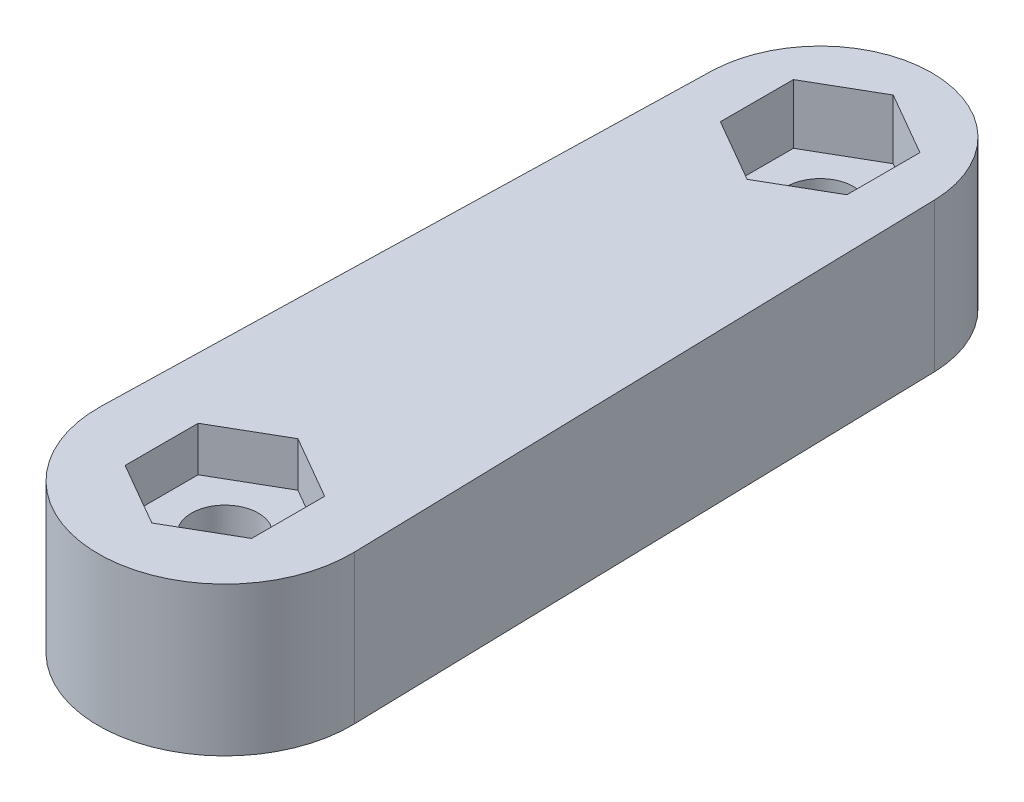
ISO-10303-21;
HEADER;
FILE_DESCRIPTION(('STEP AP214'),'2;1');
FILE_NAME('part.step','',(''),(''),'','','');
FILE_SCHEMA(('AUTOMOTIVE_DESIGN { 1 0 10303 214 1 1 1 1 }'));
ENDSEC;
DATA;
#1=APPLICATION_CONTEXT('core data for automotive mechanical design processes');
#2=APPLICATION_PROTOCOL_DEFINITION('international standard','automotive_design',2000,#1);
#3=PRODUCT_CONTEXT('',#1,'mechanical');
#4=PRODUCT('Part','Part','',(#3));
#5=PRODUCT_RELATED_PRODUCT_CATEGORY('part','',(#4));
#6=PRODUCT_DEFINITION_FORMATION('','',#4);
#7=PRODUCT_DEFINITION_CONTEXT('part definition',#1,'design');
#8=PRODUCT_DEFINITION('design','',#6,#7);
#9=PRODUCT_DEFINITION_SHAPE('','',#8);
#10=(LENGTH_UNIT() NAMED_UNIT(*) SI_UNIT(.MILLI.,.METRE.));
#11=(NAMED_UNIT(*) PLANE_ANGLE_UNIT() SI_UNIT($,.RADIAN.));
#12=(NAMED_UNIT(*) SI_UNIT($,.STERADIAN.) SOLID_ANGLE_UNIT());
#13=UNCERTAINTY_MEASURE_WITH_UNIT(LENGTH_MEASURE(1.E-05),#10,'distance_accuracy_value','');
#14=(GEOMETRIC_REPRESENTATION_CONTEXT(3) GLOBAL_UNCERTAINTY_ASSIGNED_CONTEXT((#13)) GLOBAL_UNIT_ASSIGNED_CONTEXT((#10,
#11,#12)) REPRESENTATION_CONTEXT('',''));
#15=CARTESIAN_POINT('',(0.,0.,0.));
#16=DIRECTION('',(0.,0.,1.));
#17=DIRECTION('',(1.,0.,0.));
#18=AXIS2_PLACEMENT_3D('',#15,#16,#17);
#19=CARTESIAN_POINT('',(0.,5.,0.));
#20=DIRECTION('',(0.,1.,0.));
#21=DIRECTION('',(0.,0.,1.));
#22=AXIS2_PLACEMENT_3D('',#19,#20,#21);
#23=PLANE('',#22);
#24=DIRECTION('',(0.025,0.,-0.99968745115661));
#25=VECTOR('',#24,1.);
#26=CARTESIAN_POINT('',(-4.24867166741559,5.,-0.10625));
#27=LINE('',#26,#25);
#28=CARTESIAN_POINT('',(-4.24867166741559,5.,-0.10625));
#29=VERTEX_POINT('',#28);
#30=CARTESIAN_POINT('',(-3.74882794183729,5.,-20.09375));
#31=VERTEX_POINT('',#30);
#32=EDGE_CURVE('E289',#29,#31,#27,.T.);
#33=ORIENTED_EDGE('',*,*,#32,.F.);
#34=CARTESIAN_POINT('',(0.,5.,0.));
#35=DIRECTION('',(0.,1.,0.));
#36=DIRECTION('',(0.,0.,1.));
#37=AXIS2_PLACEMENT_3D('',#34,#35,#36);
#38=CIRCLE('',#37,4.25);
#39=CARTESIAN_POINT('',(4.24867166741559,5.,-0.10625));
#40=VERTEX_POINT('',#39);
#41=EDGE_CURVE('E292',#29,#40,#38,.T.);
#42=ORIENTED_EDGE('',*,*,#41,.T.);
#43=DIRECTION('',(-0.025,0.,-0.99968745115661));
#44=VECTOR('',#43,1.);
#45=CARTESIAN_POINT('',(4.24867166741559,5.,-0.10625));
#46=LINE('',#45,#44);
#47=CARTESIAN_POINT('',(3.74882794183729,5.,-20.09375));
#48=VERTEX_POINT('',#47);
#49=EDGE_CURVE('E295',#40,#48,#46,.T.);
#50=ORIENTED_EDGE('',*,*,#49,.T.);
#51=CARTESIAN_POINT('',(0.,5.,-20.));
#52=DIRECTION('',(0.,1.,0.));
#53=DIRECTION('',(0.,0.,1.));
#54=AXIS2_PLACEMENT_3D('',#51,#52,#53);
#55=CIRCLE('',#54,3.75);
#56=EDGE_CURVE('E297',#48,#31,#55,.T.);
#57=ORIENTED_EDGE('',*,*,#56,.T.);
#58=EDGE_LOOP('',(#33,#42,#50,#57));
#59=FACE_BOUND('',#58,.T.);
#60=DIRECTION('',(-0.866025403784439,0.,0.5));
#61=VECTOR('',#60,1.);
#62=CARTESIAN_POINT('',(-1.0625,5.,-1.84030398304193));
#63=LINE('',#62,#61);
#64=CARTESIAN_POINT('',(0.,5.,-2.45373864405591));
#65=VERTEX_POINT('',#64);
#66=CARTESIAN_POINT('',(-2.125,5.,-1.22686932202796));
#67=VERTEX_POINT('',#66);
#68=EDGE_CURVE('E64',#65,#67,#63,.T.);
#69=ORIENTED_EDGE('',*,*,#68,.F.);
#70=DIRECTION('',(-0.866025403784439,0.,-0.5));
#71=VECTOR('',#70,1.);
#72=CARTESIAN_POINT('',(1.0625,5.,-1.84030398304193));
#73=LINE('',#72,#71);
#74=CARTESIAN_POINT('',(2.125,5.,-1.22686932202796));
#75=VERTEX_POINT('',#74);
#76=EDGE_CURVE('E209',#75,#65,#73,.T.);
#77=ORIENTED_EDGE('',*,*,#76,.F.);
#78=DIRECTION('',(0.,0.,-1.));
#79=VECTOR('',#78,1.);
#80=CARTESIAN_POINT('',(2.125,5.,0.));
#81=LINE('',#80,#79);
#82=CARTESIAN_POINT('',(2.125,5.,1.22686932202796));
#83=VERTEX_POINT('',#82);
#84=EDGE_CURVE('E235',#83,#75,#81,.T.);
#85=ORIENTED_EDGE('',*,*,#84,.F.);
#86=DIRECTION('',(0.866025403784439,0.,-0.5));
#87=VECTOR('',#86,1.);
#88=CARTESIAN_POINT('',(1.0625,5.,1.84030398304193));
#89=LINE('',#88,#87);
#90=CARTESIAN_POINT('',(0.,5.,2.45373864405591));
#91=VERTEX_POINT('',#90);
#92=EDGE_CURVE('E232',#91,#83,#89,.T.);
#93=ORIENTED_EDGE('',*,*,#92,.F.);
#94=DIRECTION('',(0.866025403784439,0.,0.5));
#95=VECTOR('',#94,1.);
#96=CARTESIAN_POINT('',(-1.0625,5.,1.84030398304193));
#97=LINE('',#96,#95);
#98=CARTESIAN_POINT('',(-2.125,5.,1.22686932202796));
#99=VERTEX_POINT('',#98);
#100=EDGE_CURVE('E229',#99,#91,#97,.T.);
#101=ORIENTED_EDGE('',*,*,#100,.F.);
#102=DIRECTION('',(0.,0.,1.));
#103=VECTOR('',#102,1.);
#104=CARTESIAN_POINT('',(-2.125,5.,0.));
#105=LINE('',#104,#103);
#106=EDGE_CURVE('E226',#67,#99,#105,.T.);
#107=ORIENTED_EDGE('',*,*,#106,.F.);
#108=EDGE_LOOP('',(#69,#77,#85,#93,#101,#107));
#109=FACE_BOUND('',#108,.T.);
#110=DIRECTION('',(0.866025403784439,0.,-0.5));
#111=VECTOR('',#110,1.);
#112=CARTESIAN_POINT('',(-9.72275403784438,5.,-16.8403039830419));
#113=LINE('',#112,#111);
#114=CARTESIAN_POINT('',(-2.125,5.,-21.226869322028));
#115=VERTEX_POINT('',#114);
#116=CARTESIAN_POINT('',(0.,5.,-22.4537386440559));
#117=VERTEX_POINT('',#116);
#118=EDGE_CURVE('E193',#115,#117,#113,.T.);
#119=ORIENTED_EDGE('',*,*,#118,.T.);
#120=DIRECTION('',(0.866025403784439,0.,0.499999999999999));
#121=VECTOR('',#120,1.);
#122=CARTESIAN_POINT('',(9.72275403784438,5.,-16.840303983042));
#123=LINE('',#122,#121);
#124=CARTESIAN_POINT('',(2.125,5.,-21.226869322028));
#125=VERTEX_POINT('',#124);
#126=EDGE_CURVE('E56',#117,#125,#123,.T.);
#127=ORIENTED_EDGE('',*,*,#126,.T.);
#128=DIRECTION('',(0.,0.,1.));
#129=VECTOR('',#128,1.);
#130=CARTESIAN_POINT('',(2.125,5.,0.));
#131=LINE('',#130,#129);
#132=CARTESIAN_POINT('',(2.125,5.,-18.773130677972));
#133=VERTEX_POINT('',#132);
#134=EDGE_CURVE('E197',#125,#133,#131,.T.);
#135=ORIENTED_EDGE('',*,*,#134,.T.);
#136=DIRECTION('',(-0.866025403784439,0.,0.499999999999999));
#137=VECTOR('',#136,1.);
#138=CARTESIAN_POINT('',(-7.59775403784438,5.,-13.1596960169581));
#139=LINE('',#138,#137);
#140=CARTESIAN_POINT('',(0.,5.,-17.5462613559441));
#141=VERTEX_POINT('',#140);
#142=EDGE_CURVE('E376',#133,#141,#139,.T.);
#143=ORIENTED_EDGE('',*,*,#142,.T.);
#144=DIRECTION('',(-0.866025403784439,0.,-0.5));
#145=VECTOR('',#144,1.);
#146=CARTESIAN_POINT('',(7.59775403784439,5.,-13.1596960169581));
#147=LINE('',#146,#145);
#148=CARTESIAN_POINT('',(-2.125,5.,-18.773130677972));
#149=VERTEX_POINT('',#148);
#150=EDGE_CURVE('E361',#141,#149,#147,.T.);
#151=ORIENTED_EDGE('',*,*,#150,.T.);
#152=DIRECTION('',(0.,0.,-1.));
#153=VECTOR('',#152,1.);
#154=CARTESIAN_POINT('',(-2.125,5.,0.));
#155=LINE('',#154,#153);
#156=EDGE_CURVE('E357',#149,#115,#155,.T.);
#157=ORIENTED_EDGE('',*,*,#156,.T.);
#158=EDGE_LOOP('',(#119,#127,#135,#143,#151,#157));
#159=FACE_BOUND('',#158,.T.);
#160=ADVANCED_FACE('F39',(#59,#109,#159),#23,.T.);
#161=CARTESIAN_POINT('',(0.,5.,0.));
#162=DIRECTION('',(0.,-1.,0.));
#163=DIRECTION('',(0.,0.,-1.));
#164=AXIS2_PLACEMENT_3D('',#161,#162,#163);
#165=CYLINDRICAL_SURFACE('',#164,1.125);
#166=CARTESIAN_POINT('',(0.,2.,0.));
#167=DIRECTION('',(0.,-1.,0.));
#168=DIRECTION('',(0.,0.,-1.));
#169=AXIS2_PLACEMENT_3D('',#166,#167,#168);
#170=CIRCLE('',#169,1.125);
#171=CARTESIAN_POINT('',(0.,2.,-1.125));
#172=VERTEX_POINT('',#171);
#173=EDGE_CURVE('E264',#172,#172,#170,.F.);
#174=ORIENTED_EDGE('',*,*,#173,.F.);
#175=EDGE_LOOP('',(#174));
#176=FACE_BOUND('',#175,.T.);
#177=CARTESIAN_POINT('',(0.,3.5,0.));
#178=DIRECTION('',(0.,1.,0.));
#179=DIRECTION('',(0.,0.,1.));
#180=AXIS2_PLACEMENT_3D('',#177,#178,#179);
#181=CIRCLE('',#180,1.125);
#182=CARTESIAN_POINT('',(0.,3.5,1.125));
#183=VERTEX_POINT('',#182);
#184=EDGE_CURVE('E242',#183,#183,#181,.T.);
#185=ORIENTED_EDGE('',*,*,#184,.T.);
#186=EDGE_LOOP('',(#185));
#187=FACE_BOUND('',#186,.T.);
#188=ADVANCED_FACE('F319',(#176,#187),#165,.F.);
#189=CARTESIAN_POINT('',(0.,0.,0.));
#190=DIRECTION('',(0.,1.,0.));
#191=DIRECTION('',(0.,0.,1.));
#192=AXIS2_PLACEMENT_3D('',#189,#190,#191);
#193=PLANE('',#192);
#194=CARTESIAN_POINT('',(0.,0.,-20.));
#195=DIRECTION('',(0.,1.,0.));
#196=DIRECTION('',(0.,0.,1.));
#197=AXIS2_PLACEMENT_3D('',#194,#195,#196);
#198=CIRCLE('',#197,1.125);
#199=CARTESIAN_POINT('',(0.,0.,-18.875));
#200=VERTEX_POINT('',#199);
#201=EDGE_CURVE('E293',#200,#200,#198,.T.);
#202=ORIENTED_EDGE('',*,*,#201,.T.);
#203=EDGE_LOOP('',(#202));
#204=FACE_BOUND('',#203,.T.);
#205=DIRECTION('',(0.025,0.,-0.99968745115661));
#206=VECTOR('',#205,1.);
#207=CARTESIAN_POINT('',(-4.24867166741559,0.,-0.10625));
#208=LINE('',#207,#206);
#209=CARTESIAN_POINT('',(-4.24867166741559,0.,-0.10625));
#210=VERTEX_POINT('',#209);
#211=CARTESIAN_POINT('',(-3.74882794183729,0.,-20.09375));
#212=VERTEX_POINT('',#211);
#213=EDGE_CURVE('E282',#210,#212,#208,.T.);
#214=ORIENTED_EDGE('',*,*,#213,.T.);
#215=CARTESIAN_POINT('',(0.,0.,-20.));
#216=DIRECTION('',(0.,1.,0.));
#217=DIRECTION('',(0.,0.,1.));
#218=AXIS2_PLACEMENT_3D('',#215,#216,#217);
#219=CIRCLE('',#218,3.75);
#220=CARTESIAN_POINT('',(3.74882794183729,0.,-20.09375));
#221=VERTEX_POINT('',#220);
#222=EDGE_CURVE('E306',#221,#212,#219,.T.);
#223=ORIENTED_EDGE('',*,*,#222,.F.);
#224=DIRECTION('',(-0.025,0.,-0.99968745115661));
#225=VECTOR('',#224,1.);
#226=CARTESIAN_POINT('',(4.24867166741559,0.,-0.10625));
#227=LINE('',#226,#225);
#228=CARTESIAN_POINT('',(4.24867166741559,0.,-0.10625));
#229=VERTEX_POINT('',#228);
#230=EDGE_CURVE('E304',#229,#221,#227,.T.);
#231=ORIENTED_EDGE('',*,*,#230,.F.);
#232=CARTESIAN_POINT('',(0.,0.,0.));
#233=DIRECTION('',(0.,1.,0.));
#234=DIRECTION('',(0.,0.,1.));
#235=AXIS2_PLACEMENT_3D('',#232,#233,#234);
#236=CIRCLE('',#235,4.25);
#237=EDGE_CURVE('E302',#210,#229,#236,.T.);
#238=ORIENTED_EDGE('',*,*,#237,.F.);
#239=EDGE_LOOP('',(#214,#223,#231,#238));
#240=FACE_BOUND('',#239,.T.);
#241=CARTESIAN_POINT('',(0.,0.,0.));
#242=DIRECTION('',(0.,-1.,0.));
#243=DIRECTION('',(0.,0.,-1.));
#244=AXIS2_PLACEMENT_3D('',#241,#242,#243);
#245=CIRCLE('',#244,2.85);
#246=CARTESIAN_POINT('',(2.225,0.,-1.78097585609688));
#247=VERTEX_POINT('',#246);
#248=CARTESIAN_POINT('',(2.85,0.,0.));
#249=VERTEX_POINT('',#248);
#250=EDGE_CURVE('E268',#247,#249,#245,.F.);
#251=ORIENTED_EDGE('',*,*,#250,.T.);
#252=DIRECTION('',(0.,0.,-1.));
#253=VECTOR('',#252,1.);
#254=CARTESIAN_POINT('',(2.85,0.,0.));
#255=LINE('',#254,#253);
#256=CARTESIAN_POINT('',(2.85,0.,-15.));
#257=VERTEX_POINT('',#256);
#258=EDGE_CURVE('E256',#249,#257,#255,.T.);
#259=ORIENTED_EDGE('',*,*,#258,.T.);
#260=DIRECTION('',(1.,0.,0.));
#261=VECTOR('',#260,1.);
#262=CARTESIAN_POINT('',(0.,0.,-15.));
#263=LINE('',#262,#261);
#264=CARTESIAN_POINT('',(2.225,0.,-15.));
#265=VERTEX_POINT('',#264);
#266=EDGE_CURVE('E274',#265,#257,#263,.T.);
#267=ORIENTED_EDGE('',*,*,#266,.F.);
#268=DIRECTION('',(0.,0.,-1.));
#269=VECTOR('',#268,1.);
#270=CARTESIAN_POINT('',(2.225,0.,0.));
#271=LINE('',#270,#269);
#272=EDGE_CURVE('E271',#247,#265,#271,.T.);
#273=ORIENTED_EDGE('',*,*,#272,.F.);
#274=EDGE_LOOP('',(#251,#259,#267,#273));
#275=FACE_BOUND('',#274,.T.);
#276=ADVANCED_FACE('F444',(#204,#240,#275),#193,.F.);
#277=CARTESIAN_POINT('',(-4.24867166741559,5.,-0.10625));
#278=DIRECTION('',(-0.99968745115661,0.,-0.025));
#279=DIRECTION('',(-0.025,0.,0.99968745115661));
#280=AXIS2_PLACEMENT_3D('',#277,#278,#279);
#281=PLANE('',#280);
#282=ORIENTED_EDGE('',*,*,#213,.F.);
#283=DIRECTION('',(0.,-1.,0.));
#284=VECTOR('',#283,1.);
#285=CARTESIAN_POINT('',(-4.24867166741559,5.,-0.10625));
#286=LINE('',#285,#284);
#287=EDGE_CURVE('E11',#29,#210,#286,.T.);
#288=ORIENTED_EDGE('',*,*,#287,.F.);
#289=ORIENTED_EDGE('',*,*,#32,.T.);
#290=DIRECTION('',(0.,-1.,0.));
#291=VECTOR('',#290,1.);
#292=CARTESIAN_POINT('',(-3.74882794183729,5.,-20.09375));
#293=LINE('',#292,#291);
#294=EDGE_CURVE('E299',#31,#212,#293,.T.);
#295=ORIENTED_EDGE('',*,*,#294,.T.);
#296=EDGE_LOOP('',(#282,#288,#289,#295));
#297=FACE_BOUND('',#296,.T.);
#298=ADVANCED_FACE('F41',(#297),#281,.T.);
#299=CARTESIAN_POINT('',(0.,5.,0.));
#300=DIRECTION('',(0.,-1.,0.));
#301=DIRECTION('',(0.,0.,-1.));
#302=AXIS2_PLACEMENT_3D('',#299,#300,#301);
#303=CYLINDRICAL_SURFACE('',#302,4.25);
#304=ORIENTED_EDGE('',*,*,#237,.T.);
#305=DIRECTION('',(0.,-1.,0.));
#306=VECTOR('',#305,1.);
#307=CARTESIAN_POINT('',(4.24867166741559,5.,-0.10625));
#308=LINE('',#307,#306);
#309=EDGE_CURVE('E48',#40,#229,#308,.T.);
#310=ORIENTED_EDGE('',*,*,#309,.F.);
#311=ORIENTED_EDGE('',*,*,#41,.F.);
#312=ORIENTED_EDGE('',*,*,#287,.T.);
#313=EDGE_LOOP('',(#304,#310,#311,#312));
#314=FACE_BOUND('',#313,.T.);
#315=ADVANCED_FACE('F460',(#314),#303,.T.);
#316=CARTESIAN_POINT('',(4.24867166741559,5.,-0.10625));
#317=DIRECTION('',(-0.99968745115661,0.,0.025));
#318=DIRECTION('',(0.025,0.,0.99968745115661));
#319=AXIS2_PLACEMENT_3D('',#316,#317,#318);
#320=PLANE('',#319);
#321=ORIENTED_EDGE('',*,*,#230,.T.);
#322=DIRECTION('',(0.,-1.,0.));
#323=VECTOR('',#322,1.);
#324=CARTESIAN_POINT('',(3.74882794183729,5.,-20.09375));
#325=LINE('',#324,#323);
#326=EDGE_CURVE('E312',#48,#221,#325,.T.);
#327=ORIENTED_EDGE('',*,*,#326,.F.);
#328=ORIENTED_EDGE('',*,*,#49,.F.);
#329=ORIENTED_EDGE('',*,*,#309,.T.);
#330=EDGE_LOOP('',(#321,#327,#328,#329));
#331=FACE_BOUND('',#330,.T.);
#332=ADVANCED_FACE('F454',(#331),#320,.F.);
#333=CARTESIAN_POINT('',(0.,5.,-20.));
#334=DIRECTION('',(0.,-1.,0.));
#335=DIRECTION('',(0.,0.,-1.));
#336=AXIS2_PLACEMENT_3D('',#333,#334,#335);
#337=CYLINDRICAL_SURFACE('',#336,1.125);
#338=CARTESIAN_POINT('',(0.,3.,-20.));
#339=DIRECTION('',(0.,-1.,0.));
#340=DIRECTION('',(0.,0.,-1.));
#341=AXIS2_PLACEMENT_3D('',#338,#339,#340);
#342=CIRCLE('',#341,1.125);
#343=CARTESIAN_POINT('',(0.,3.,-21.125));
#344=VERTEX_POINT('',#343);
#345=EDGE_CURVE('E43',#344,#344,#342,.T.);
#346=ORIENTED_EDGE('',*,*,#345,.F.);
#347=EDGE_LOOP('',(#346));
#348=FACE_BOUND('',#347,.T.);
#349=ORIENTED_EDGE('',*,*,#201,.F.);
#350=EDGE_LOOP('',(#349));
#351=FACE_BOUND('',#350,.T.);
#352=ADVANCED_FACE('F451',(#348,#351),#337,.F.);
#353=CARTESIAN_POINT('',(0.,5.,-20.));
#354=DIRECTION('',(0.,-1.,0.));
#355=DIRECTION('',(0.,0.,-1.));
#356=AXIS2_PLACEMENT_3D('',#353,#354,#355);
#357=CYLINDRICAL_SURFACE('',#356,3.75);
#358=ORIENTED_EDGE('',*,*,#222,.T.);
#359=ORIENTED_EDGE('',*,*,#294,.F.);
#360=ORIENTED_EDGE('',*,*,#56,.F.);
#361=ORIENTED_EDGE('',*,*,#326,.T.);
#362=EDGE_LOOP('',(#358,#359,#360,#361));
#363=FACE_BOUND('',#362,.T.);
#364=ADVANCED_FACE('F441',(#363),#357,.T.);
#365=CARTESIAN_POINT('',(0.,2.,0.));
#366=DIRECTION('',(0.,-1.,0.));
#367=DIRECTION('',(0.,0.,-1.));
#368=AXIS2_PLACEMENT_3D('',#365,#366,#367);
#369=CYLINDRICAL_SURFACE('',#368,2.85);
#370=ORIENTED_EDGE('',*,*,#250,.F.);
#371=DIRECTION('',(0.,-1.,0.));
#372=VECTOR('',#371,1.);
#373=CARTESIAN_POINT('',(2.225,2.,-1.78097585609688));
#374=LINE('',#373,#372);
#375=CARTESIAN_POINT('',(2.225,2.,-1.78097585609688));
#376=VERTEX_POINT('',#375);
#377=EDGE_CURVE('E267',#376,#247,#374,.T.);
#378=ORIENTED_EDGE('',*,*,#377,.F.);
#379=CARTESIAN_POINT('',(0.,2.,0.));
#380=DIRECTION('',(0.,-1.,0.));
#381=DIRECTION('',(0.,0.,-1.));
#382=AXIS2_PLACEMENT_3D('',#379,#380,#381);
#383=CIRCLE('',#382,2.85);
#384=CARTESIAN_POINT('',(2.85,2.,0.));
#385=VERTEX_POINT('',#384);
#386=EDGE_CURVE('E252',#376,#385,#383,.F.);
#387=ORIENTED_EDGE('',*,*,#386,.T.);
#388=DIRECTION('',(0.,-1.,0.));
#389=VECTOR('',#388,1.);
#390=CARTESIAN_POINT('',(2.85,2.,0.));
#391=LINE('',#390,#389);
#392=EDGE_CURVE('E279',#385,#249,#391,.T.);
#393=ORIENTED_EDGE('',*,*,#392,.T.);
#394=EDGE_LOOP('',(#370,#378,#387,#393));
#395=FACE_BOUND('',#394,.T.);
#396=ADVANCED_FACE('F432',(#395),#369,.F.);
#397=CARTESIAN_POINT('',(2.85,2.,0.));
#398=DIRECTION('',(-1.,0.,0.));
#399=DIRECTION('',(0.,0.,1.));
#400=AXIS2_PLACEMENT_3D('',#397,#398,#399);
#401=PLANE('',#400);
#402=ORIENTED_EDGE('',*,*,#258,.F.);
#403=ORIENTED_EDGE('',*,*,#392,.F.);
#404=DIRECTION('',(0.,0.,-1.));
#405=VECTOR('',#404,1.);
#406=CARTESIAN_POINT('',(2.85,2.,0.));
#407=LINE('',#406,#405);
#408=CARTESIAN_POINT('',(2.85,2.,-15.));
#409=VERTEX_POINT('',#408);
#410=EDGE_CURVE('E262',#385,#409,#407,.T.);
#411=ORIENTED_EDGE('',*,*,#410,.T.);
#412=DIRECTION('',(0.,-1.,0.));
#413=VECTOR('',#412,1.);
#414=CARTESIAN_POINT('',(2.85,2.,-15.));
#415=LINE('',#414,#413);
#416=EDGE_CURVE('E283',#409,#257,#415,.T.);
#417=ORIENTED_EDGE('',*,*,#416,.T.);
#418=EDGE_LOOP('',(#402,#403,#411,#417));
#419=FACE_BOUND('',#418,.T.);
#420=ADVANCED_FACE('F428',(#419),#401,.T.);
#421=CARTESIAN_POINT('',(0.,2.,-15.));
#422=DIRECTION('',(0.,0.,-1.));
#423=DIRECTION('',(-1.,0.,0.));
#424=AXIS2_PLACEMENT_3D('',#421,#422,#423);
#425=PLANE('',#424);
#426=ORIENTED_EDGE('',*,*,#266,.T.);
#427=ORIENTED_EDGE('',*,*,#416,.F.);
#428=DIRECTION('',(1.,0.,0.));
#429=VECTOR('',#428,1.);
#430=CARTESIAN_POINT('',(0.,2.,-15.));
#431=LINE('',#430,#429);
#432=CARTESIAN_POINT('',(2.225,2.,-15.));
#433=VERTEX_POINT('',#432);
#434=EDGE_CURVE('E259',#433,#409,#431,.T.);
#435=ORIENTED_EDGE('',*,*,#434,.F.);
#436=DIRECTION('',(0.,-1.,0.));
#437=VECTOR('',#436,1.);
#438=CARTESIAN_POINT('',(2.225,2.,-15.));
#439=LINE('',#438,#437);
#440=EDGE_CURVE('E285',#433,#265,#439,.T.);
#441=ORIENTED_EDGE('',*,*,#440,.T.);
#442=EDGE_LOOP('',(#426,#427,#435,#441));
#443=FACE_BOUND('',#442,.T.);
#444=ADVANCED_FACE('F431',(#443),#425,.F.);
#445=CARTESIAN_POINT('',(2.225,2.,0.));
#446=DIRECTION('',(-1.,0.,0.));
#447=DIRECTION('',(0.,0.,1.));
#448=AXIS2_PLACEMENT_3D('',#445,#446,#447);
#449=PLANE('',#448);
#450=ORIENTED_EDGE('',*,*,#272,.T.);
#451=ORIENTED_EDGE('',*,*,#440,.F.);
#452=DIRECTION('',(0.,0.,-1.));
#453=VECTOR('',#452,1.);
#454=CARTESIAN_POINT('',(2.225,2.,0.));
#455=LINE('',#454,#453);
#456=EDGE_CURVE('E255',#376,#433,#455,.T.);
#457=ORIENTED_EDGE('',*,*,#456,.F.);
#458=ORIENTED_EDGE('',*,*,#377,.T.);
#459=EDGE_LOOP('',(#450,#451,#457,#458));
#460=FACE_BOUND('',#459,.T.);
#461=ADVANCED_FACE('F426',(#460),#449,.F.);
#462=CARTESIAN_POINT('',(0.,2.,0.));
#463=DIRECTION('',(0.,-1.,0.));
#464=DIRECTION('',(0.,0.,-1.));
#465=AXIS2_PLACEMENT_3D('',#462,#463,#464);
#466=PLANE('',#465);
#467=ORIENTED_EDGE('',*,*,#386,.F.);
#468=ORIENTED_EDGE('',*,*,#456,.T.);
#469=ORIENTED_EDGE('',*,*,#434,.T.);
#470=ORIENTED_EDGE('',*,*,#410,.F.);
#471=EDGE_LOOP('',(#467,#468,#469,#470));
#472=FACE_BOUND('',#471,.T.);
#473=ORIENTED_EDGE('',*,*,#173,.T.);
#474=EDGE_LOOP('',(#473));
#475=FACE_BOUND('',#474,.T.);
#476=ADVANCED_FACE('F423',(#472,#475),#466,.T.);
#477=CARTESIAN_POINT('',(-1.0625,3.5,-1.84030398304193));
#478=DIRECTION('',(-0.5,0.,-0.866025403784439));
#479=DIRECTION('',(-0.866025403784439,0.,0.5));
#480=AXIS2_PLACEMENT_3D('',#477,#478,#479);
#481=PLANE('',#480);
#482=ORIENTED_EDGE('',*,*,#68,.T.);
#483=DIRECTION('',(0.,1.,0.));
#484=VECTOR('',#483,1.);
#485=CARTESIAN_POINT('',(-2.125,3.5,-1.22686932202796));
#486=LINE('',#485,#484);
#487=CARTESIAN_POINT('',(-2.125,3.5,-1.22686932202796));
#488=VERTEX_POINT('',#487);
#489=EDGE_CURVE('E224',#488,#67,#486,.T.);
#490=ORIENTED_EDGE('',*,*,#489,.F.);
#491=DIRECTION('',(-0.866025403784439,0.,0.5));
#492=VECTOR('',#491,1.);
#493=CARTESIAN_POINT('',(-1.0625,3.5,-1.84030398304193));
#494=LINE('',#493,#492);
#495=CARTESIAN_POINT('',(0.,3.5,-2.45373864405591));
#496=VERTEX_POINT('',#495);
#497=EDGE_CURVE('E205',#496,#488,#494,.T.);
#498=ORIENTED_EDGE('',*,*,#497,.F.);
#499=DIRECTION('',(0.,1.,0.));
#500=VECTOR('',#499,1.);
#501=CARTESIAN_POINT('',(0.,3.5,-2.45373864405591));
#502=LINE('',#501,#500);
#503=EDGE_CURVE('E240',#496,#65,#502,.T.);
#504=ORIENTED_EDGE('',*,*,#503,.T.);
#505=EDGE_LOOP('',(#482,#490,#498,#504));
#506=FACE_BOUND('',#505,.T.);
#507=ADVANCED_FACE('F329',(#506),#481,.F.);
#508=CARTESIAN_POINT('',(1.0625,3.5,-1.84030398304193));
#509=DIRECTION('',(0.5,0.,-0.866025403784439));
#510=DIRECTION('',(-0.866025403784439,0.,-0.5));
#511=AXIS2_PLACEMENT_3D('',#508,#509,#510);
#512=PLANE('',#511);
#513=ORIENTED_EDGE('',*,*,#76,.T.);
#514=ORIENTED_EDGE('',*,*,#503,.F.);
#515=DIRECTION('',(-0.866025403784439,0.,-0.5));
#516=VECTOR('',#515,1.);
#517=CARTESIAN_POINT('',(1.0625,3.5,-1.84030398304193));
#518=LINE('',#517,#516);
#519=CARTESIAN_POINT('',(2.125,3.5,-1.22686932202796));
#520=VERTEX_POINT('',#519);
#521=EDGE_CURVE('E221',#520,#496,#518,.T.);
#522=ORIENTED_EDGE('',*,*,#521,.F.);
#523=DIRECTION('',(0.,1.,0.));
#524=VECTOR('',#523,1.);
#525=CARTESIAN_POINT('',(2.125,3.5,-1.22686932202796));
#526=LINE('',#525,#524);
#527=EDGE_CURVE('E243',#520,#75,#526,.T.);
#528=ORIENTED_EDGE('',*,*,#527,.T.);
#529=EDGE_LOOP('',(#513,#514,#522,#528));
#530=FACE_BOUND('',#529,.T.);
#531=ADVANCED_FACE('F346',(#530),#512,.F.);
#532=CARTESIAN_POINT('',(2.125,3.5,0.));
#533=DIRECTION('',(1.,0.,0.));
#534=DIRECTION('',(0.,0.,-1.));
#535=AXIS2_PLACEMENT_3D('',#532,#533,#534);
#536=PLANE('',#535);
#537=ORIENTED_EDGE('',*,*,#84,.T.);
#538=ORIENTED_EDGE('',*,*,#527,.F.);
#539=DIRECTION('',(0.,0.,-1.));
#540=VECTOR('',#539,1.);
#541=CARTESIAN_POINT('',(2.125,3.5,0.));
#542=LINE('',#541,#540);
#543=CARTESIAN_POINT('',(2.125,3.5,1.22686932202796));
#544=VERTEX_POINT('',#543);
#545=EDGE_CURVE('E218',#544,#520,#542,.T.);
#546=ORIENTED_EDGE('',*,*,#545,.F.);
#547=DIRECTION('',(0.,1.,0.));
#548=VECTOR('',#547,1.);
#549=CARTESIAN_POINT('',(2.125,3.5,1.22686932202796));
#550=LINE('',#549,#548);
#551=EDGE_CURVE('E245',#544,#83,#550,.T.);
#552=ORIENTED_EDGE('',*,*,#551,.T.);
#553=EDGE_LOOP('',(#537,#538,#546,#552));
#554=FACE_BOUND('',#553,.T.);
#555=ADVANCED_FACE('F343',(#554),#536,.F.);
#556=CARTESIAN_POINT('',(1.0625,3.5,1.84030398304193));
#557=DIRECTION('',(0.5,0.,0.866025403784439));
#558=DIRECTION('',(0.866025403784439,0.,-0.5));
#559=AXIS2_PLACEMENT_3D('',#556,#557,#558);
#560=PLANE('',#559);
#561=ORIENTED_EDGE('',*,*,#92,.T.);
#562=ORIENTED_EDGE('',*,*,#551,.F.);
#563=DIRECTION('',(0.866025403784439,0.,-0.5));
#564=VECTOR('',#563,1.);
#565=CARTESIAN_POINT('',(1.0625,3.5,1.84030398304193));
#566=LINE('',#565,#564);
#567=CARTESIAN_POINT('',(0.,3.5,2.45373864405591));
#568=VERTEX_POINT('',#567);
#569=EDGE_CURVE('E215',#568,#544,#566,.T.);
#570=ORIENTED_EDGE('',*,*,#569,.F.);
#571=DIRECTION('',(0.,1.,0.));
#572=VECTOR('',#571,1.);
#573=CARTESIAN_POINT('',(0.,3.5,2.45373864405591));
#574=LINE('',#573,#572);
#575=EDGE_CURVE('E247',#568,#91,#574,.T.);
#576=ORIENTED_EDGE('',*,*,#575,.T.);
#577=EDGE_LOOP('',(#561,#562,#570,#576));
#578=FACE_BOUND('',#577,.T.);
#579=ADVANCED_FACE('F339',(#578),#560,.F.);
#580=CARTESIAN_POINT('',(-1.0625,3.5,1.84030398304193));
#581=DIRECTION('',(-0.5,0.,0.866025403784439));
#582=DIRECTION('',(0.866025403784439,0.,0.5));
#583=AXIS2_PLACEMENT_3D('',#580,#581,#582);
#584=PLANE('',#583);
#585=ORIENTED_EDGE('',*,*,#100,.T.);
#586=ORIENTED_EDGE('',*,*,#575,.F.);
#587=DIRECTION('',(0.866025403784439,0.,0.5));
#588=VECTOR('',#587,1.);
#589=CARTESIAN_POINT('',(-1.0625,3.5,1.84030398304193));
#590=LINE('',#589,#588);
#591=CARTESIAN_POINT('',(-2.125,3.5,1.22686932202796));
#592=VERTEX_POINT('',#591);
#593=EDGE_CURVE('E212',#592,#568,#590,.T.);
#594=ORIENTED_EDGE('',*,*,#593,.F.);
#595=DIRECTION('',(0.,1.,0.));
#596=VECTOR('',#595,1.);
#597=CARTESIAN_POINT('',(-2.125,3.5,1.22686932202796));
#598=LINE('',#597,#596);
#599=EDGE_CURVE('E249',#592,#99,#598,.T.);
#600=ORIENTED_EDGE('',*,*,#599,.T.);
#601=EDGE_LOOP('',(#585,#586,#594,#600));
#602=FACE_BOUND('',#601,.T.);
#603=ADVANCED_FACE('F335',(#602),#584,.F.);
#604=CARTESIAN_POINT('',(-2.125,3.5,0.));
#605=DIRECTION('',(-1.,0.,0.));
#606=DIRECTION('',(0.,0.,1.));
#607=AXIS2_PLACEMENT_3D('',#604,#605,#606);
#608=PLANE('',#607);
#609=ORIENTED_EDGE('',*,*,#106,.T.);
#610=ORIENTED_EDGE('',*,*,#599,.F.);
#611=DIRECTION('',(0.,0.,1.));
#612=VECTOR('',#611,1.);
#613=CARTESIAN_POINT('',(-2.125,3.5,0.));
#614=LINE('',#613,#612);
#615=EDGE_CURVE('E208',#488,#592,#614,.T.);
#616=ORIENTED_EDGE('',*,*,#615,.F.);
#617=ORIENTED_EDGE('',*,*,#489,.T.);
#618=EDGE_LOOP('',(#609,#610,#616,#617));
#619=FACE_BOUND('',#618,.T.);
#620=ADVANCED_FACE('F324',(#619),#608,.F.);
#621=CARTESIAN_POINT('',(0.,3.5,0.));
#622=DIRECTION('',(0.,1.,0.));
#623=DIRECTION('',(0.,0.,1.));
#624=AXIS2_PLACEMENT_3D('',#621,#622,#623);
#625=PLANE('',#624);
#626=ORIENTED_EDGE('',*,*,#184,.F.);
#627=EDGE_LOOP('',(#626));
#628=FACE_BOUND('',#627,.T.);
#629=ORIENTED_EDGE('',*,*,#497,.T.);
#630=ORIENTED_EDGE('',*,*,#615,.T.);
#631=ORIENTED_EDGE('',*,*,#593,.T.);
#632=ORIENTED_EDGE('',*,*,#569,.T.);
#633=ORIENTED_EDGE('',*,*,#545,.T.);
#634=ORIENTED_EDGE('',*,*,#521,.T.);
#635=EDGE_LOOP('',(#629,#630,#631,#632,#633,#634));
#636=FACE_BOUND('',#635,.T.);
#637=ADVANCED_FACE('F321',(#628,#636),#625,.T.);
#638=CARTESIAN_POINT('',(9.72275403784438,3.,-16.840303983042));
#639=DIRECTION('',(-0.499999999999999,0.,0.866025403784439));
#640=DIRECTION('',(0.866025403784439,0.,0.499999999999999));
#641=AXIS2_PLACEMENT_3D('',#638,#639,#640);
#642=PLANE('',#641);
#643=ORIENTED_EDGE('',*,*,#126,.F.);
#644=DIRECTION('',(0.,1.,0.));
#645=VECTOR('',#644,1.);
#646=CARTESIAN_POINT('',(0.,3.,-22.4537386440559));
#647=LINE('',#646,#645);
#648=CARTESIAN_POINT('',(0.,3.,-22.4537386440559));
#649=VERTEX_POINT('',#648);
#650=EDGE_CURVE('E192',#649,#117,#647,.T.);
#651=ORIENTED_EDGE('',*,*,#650,.F.);
#652=DIRECTION('',(0.866025403784439,0.,0.499999999999999));
#653=VECTOR('',#652,1.);
#654=CARTESIAN_POINT('',(9.72275403784438,3.,-16.840303983042));
#655=LINE('',#654,#653);
#656=CARTESIAN_POINT('',(2.125,3.,-21.226869322028));
#657=VERTEX_POINT('',#656);
#658=EDGE_CURVE('E183',#649,#657,#655,.T.);
#659=ORIENTED_EDGE('',*,*,#658,.T.);
#660=DIRECTION('',(0.,1.,0.));
#661=VECTOR('',#660,1.);
#662=CARTESIAN_POINT('',(2.125,3.,-21.226869322028));
#663=LINE('',#662,#661);
#664=EDGE_CURVE('E191',#657,#125,#663,.T.);
#665=ORIENTED_EDGE('',*,*,#664,.T.);
#666=EDGE_LOOP('',(#643,#651,#659,#665));
#667=FACE_BOUND('',#666,.T.);
#668=ADVANCED_FACE('F190',(#667),#642,.T.);
#669=CARTESIAN_POINT('',(2.125,3.,0.));
#670=DIRECTION('',(-1.,0.,0.));
#671=DIRECTION('',(0.,0.,1.));
#672=AXIS2_PLACEMENT_3D('',#669,#670,#671);
#673=PLANE('',#672);
#674=ORIENTED_EDGE('',*,*,#134,.F.);
#675=ORIENTED_EDGE('',*,*,#664,.F.);
#676=DIRECTION('',(0.,0.,1.));
#677=VECTOR('',#676,1.);
#678=CARTESIAN_POINT('',(2.125,3.,0.));
#679=LINE('',#678,#677);
#680=CARTESIAN_POINT('',(2.125,3.,-18.773130677972));
#681=VERTEX_POINT('',#680);
#682=EDGE_CURVE('E179',#657,#681,#679,.T.);
#683=ORIENTED_EDGE('',*,*,#682,.T.);
#684=DIRECTION('',(0.,1.,0.));
#685=VECTOR('',#684,1.);
#686=CARTESIAN_POINT('',(2.125,3.,-18.773130677972));
#687=LINE('',#686,#685);
#688=EDGE_CURVE('E198',#681,#133,#687,.T.);
#689=ORIENTED_EDGE('',*,*,#688,.T.);
#690=EDGE_LOOP('',(#674,#675,#683,#689));
#691=FACE_BOUND('',#690,.T.);
#692=ADVANCED_FACE('F195',(#691),#673,.T.);
#693=CARTESIAN_POINT('',(-7.59775403784438,3.,-13.1596960169581));
#694=DIRECTION('',(-0.499999999999999,0.,-0.866025403784439));
#695=DIRECTION('',(-0.866025403784439,0.,0.499999999999999));
#696=AXIS2_PLACEMENT_3D('',#693,#694,#695);
#697=PLANE('',#696);
#698=ORIENTED_EDGE('',*,*,#142,.F.);
#699=ORIENTED_EDGE('',*,*,#688,.F.);
#700=DIRECTION('',(-0.866025403784439,0.,0.499999999999999));
#701=VECTOR('',#700,1.);
#702=CARTESIAN_POINT('',(-7.59775403784438,3.,-13.1596960169581));
#703=LINE('',#702,#701);
#704=CARTESIAN_POINT('',(0.,3.,-17.5462613559441));
#705=VERTEX_POINT('',#704);
#706=EDGE_CURVE('E185',#681,#705,#703,.T.);
#707=ORIENTED_EDGE('',*,*,#706,.T.);
#708=DIRECTION('',(0.,1.,0.));
#709=VECTOR('',#708,1.);
#710=CARTESIAN_POINT('',(0.,3.,-17.5462613559441));
#711=LINE('',#710,#709);
#712=EDGE_CURVE('E201',#705,#141,#711,.T.);
#713=ORIENTED_EDGE('',*,*,#712,.T.);
#714=EDGE_LOOP('',(#698,#699,#707,#713));
#715=FACE_BOUND('',#714,.T.);
#716=ADVANCED_FACE('F374',(#715),#697,.T.);
#717=CARTESIAN_POINT('',(7.59775403784439,3.,-13.1596960169581));
#718=DIRECTION('',(0.5,0.,-0.866025403784439));
#719=DIRECTION('',(-0.866025403784439,0.,-0.5));
#720=AXIS2_PLACEMENT_3D('',#717,#718,#719);
#721=PLANE('',#720);
#722=ORIENTED_EDGE('',*,*,#150,.F.);
#723=ORIENTED_EDGE('',*,*,#712,.F.);
#724=DIRECTION('',(-0.866025403784439,0.,-0.5));
#725=VECTOR('',#724,1.);
#726=CARTESIAN_POINT('',(7.59775403784439,3.,-13.1596960169581));
#727=LINE('',#726,#725);
#728=CARTESIAN_POINT('',(-2.125,3.,-18.773130677972));
#729=VERTEX_POINT('',#728);
#730=EDGE_CURVE('E387',#705,#729,#727,.T.);
#731=ORIENTED_EDGE('',*,*,#730,.T.);
#732=DIRECTION('',(0.,1.,0.));
#733=VECTOR('',#732,1.);
#734=CARTESIAN_POINT('',(-2.125,3.,-18.773130677972));
#735=LINE('',#734,#733);
#736=EDGE_CURVE('E369',#729,#149,#735,.T.);
#737=ORIENTED_EDGE('',*,*,#736,.T.);
#738=EDGE_LOOP('',(#722,#723,#731,#737));
#739=FACE_BOUND('',#738,.T.);
#740=ADVANCED_FACE('F378',(#739),#721,.T.);
#741=CARTESIAN_POINT('',(-2.125,3.,0.));
#742=DIRECTION('',(1.,0.,0.));
#743=DIRECTION('',(0.,0.,-1.));
#744=AXIS2_PLACEMENT_3D('',#741,#742,#743);
#745=PLANE('',#744);
#746=ORIENTED_EDGE('',*,*,#156,.F.);
#747=ORIENTED_EDGE('',*,*,#736,.F.);
#748=DIRECTION('',(0.,0.,-1.));
#749=VECTOR('',#748,1.);
#750=CARTESIAN_POINT('',(-2.125,3.,0.));
#751=LINE('',#750,#749);
#752=CARTESIAN_POINT('',(-2.125,3.,-21.226869322028));
#753=VERTEX_POINT('',#752);
#754=EDGE_CURVE('E385',#729,#753,#751,.T.);
#755=ORIENTED_EDGE('',*,*,#754,.T.);
#756=DIRECTION('',(0.,1.,0.));
#757=VECTOR('',#756,1.);
#758=CARTESIAN_POINT('',(-2.125,3.,-21.226869322028));
#759=LINE('',#758,#757);
#760=EDGE_CURVE('E366',#753,#115,#759,.T.);
#761=ORIENTED_EDGE('',*,*,#760,.T.);
#762=EDGE_LOOP('',(#746,#747,#755,#761));
#763=FACE_BOUND('',#762,.T.);
#764=ADVANCED_FACE('F391',(#763),#745,.T.);
#765=CARTESIAN_POINT('',(-9.72275403784438,3.,-16.8403039830419));
#766=DIRECTION('',(0.5,0.,0.866025403784439));
#767=DIRECTION('',(0.866025403784439,0.,-0.5));
#768=AXIS2_PLACEMENT_3D('',#765,#766,#767);
#769=PLANE('',#768);
#770=ORIENTED_EDGE('',*,*,#118,.F.);
#771=ORIENTED_EDGE('',*,*,#760,.F.);
#772=DIRECTION('',(0.866025403784439,0.,-0.5));
#773=VECTOR('',#772,1.);
#774=CARTESIAN_POINT('',(-9.72275403784438,3.,-16.8403039830419));
#775=LINE('',#774,#773);
#776=EDGE_CURVE('E367',#753,#649,#775,.T.);
#777=ORIENTED_EDGE('',*,*,#776,.T.);
#778=ORIENTED_EDGE('',*,*,#650,.T.);
#779=EDGE_LOOP('',(#770,#771,#777,#778));
#780=FACE_BOUND('',#779,.T.);
#781=ADVANCED_FACE('F392',(#780),#769,.T.);
#782=CARTESIAN_POINT('',(0.,3.,0.));
#783=DIRECTION('',(0.,-1.,0.));
#784=DIRECTION('',(0.,0.,-1.));
#785=AXIS2_PLACEMENT_3D('',#782,#783,#784);
#786=PLANE('',#785);
#787=ORIENTED_EDGE('',*,*,#345,.T.);
#788=EDGE_LOOP('',(#787));
#789=FACE_BOUND('',#788,.T.);
#790=ORIENTED_EDGE('',*,*,#658,.F.);
#791=ORIENTED_EDGE('',*,*,#776,.F.);
#792=ORIENTED_EDGE('',*,*,#754,.F.);
#793=ORIENTED_EDGE('',*,*,#730,.F.);
#794=ORIENTED_EDGE('',*,*,#706,.F.);
#795=ORIENTED_EDGE('',*,*,#682,.F.);
#796=EDGE_LOOP('',(#790,#791,#792,#793,#794,#795));
#797=FACE_BOUND('',#796,.T.);
#798=ADVANCED_FACE('F181',(#789,#797),#786,.F.);
#799=CLOSED_SHELL('',(#160,#188,#276,#298,#315,#332,#352,#364,#396,#420,#444,#461,#476,#507,
#531,#555,#579,#603,#620,#637,#668,#692,#716,#740,#764,#781,#798));
#800=MANIFOLD_SOLID_BREP('B2',#799);
#801=ADVANCED_BREP_SHAPE_REPRESENTATION('',(#18,#800),#14);
#802=SHAPE_DEFINITION_REPRESENTATION(#9,#801);
ENDSEC;
END-ISO-10303-21;
